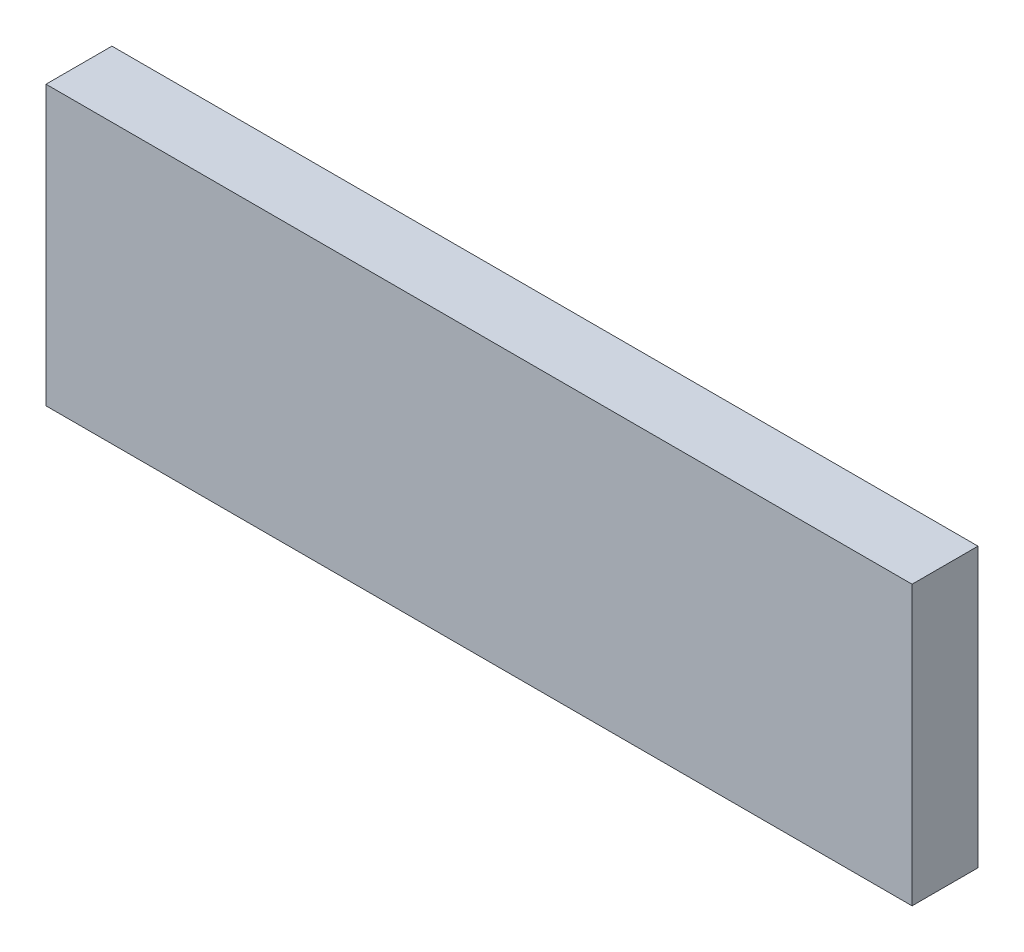
ISO-10303-21;
HEADER;
FILE_DESCRIPTION(('STEP AP214'),'2;1');
FILE_NAME('part.step','',(''),(''),'','','');
FILE_SCHEMA(('AUTOMOTIVE_DESIGN { 1 0 10303 214 1 1 1 1 }'));
ENDSEC;
DATA;
#1=APPLICATION_CONTEXT('core data for automotive mechanical design processes');
#2=APPLICATION_PROTOCOL_DEFINITION('international standard','automotive_design',2000,#1);
#3=PRODUCT_CONTEXT('',#1,'mechanical');
#4=PRODUCT('Part','Part','',(#3));
#5=PRODUCT_RELATED_PRODUCT_CATEGORY('part','',(#4));
#6=PRODUCT_DEFINITION_FORMATION('','',#4);
#7=PRODUCT_DEFINITION_CONTEXT('part definition',#1,'design');
#8=PRODUCT_DEFINITION('design','',#6,#7);
#9=PRODUCT_DEFINITION_SHAPE('','',#8);
#10=(LENGTH_UNIT() NAMED_UNIT(*) SI_UNIT(.MILLI.,.METRE.));
#11=(NAMED_UNIT(*) PLANE_ANGLE_UNIT() SI_UNIT($,.RADIAN.));
#12=(NAMED_UNIT(*) SI_UNIT($,.STERADIAN.) SOLID_ANGLE_UNIT());
#13=UNCERTAINTY_MEASURE_WITH_UNIT(LENGTH_MEASURE(1.E-05),#10,'distance_accuracy_value','');
#14=(GEOMETRIC_REPRESENTATION_CONTEXT(3) GLOBAL_UNCERTAINTY_ASSIGNED_CONTEXT((#13)) GLOBAL_UNIT_ASSIGNED_CONTEXT((#10,
#11,#12)) REPRESENTATION_CONTEXT('',''));
#15=CARTESIAN_POINT('',(0.,0.,0.));
#16=DIRECTION('',(0.,0.,1.));
#17=DIRECTION('',(1.,0.,0.));
#18=AXIS2_PLACEMENT_3D('',#15,#16,#17);
#19=CARTESIAN_POINT('',(13.135,4.225,2.));
#20=DIRECTION('',(-1.,0.,0.));
#21=DIRECTION('',(0.,-1.,0.));
#22=AXIS2_PLACEMENT_3D('',#19,#20,#21);
#23=PLANE('',#22);
#24=DIRECTION('',(0.,1.,0.));
#25=VECTOR('',#24,1.);
#26=CARTESIAN_POINT('',(13.135,4.225,0.));
#27=LINE('',#26,#25);
#28=CARTESIAN_POINT('',(13.135,-4.225,0.));
#29=VERTEX_POINT('',#28);
#30=CARTESIAN_POINT('',(13.135,4.225,0.));
#31=VERTEX_POINT('',#30);
#32=EDGE_CURVE('E99',#29,#31,#27,.T.);
#33=ORIENTED_EDGE('',*,*,#32,.T.);
#34=DIRECTION('',(0.,0.,-1.));
#35=VECTOR('',#34,1.);
#36=CARTESIAN_POINT('',(13.135,4.225,2.));
#37=LINE('',#36,#35);
#38=CARTESIAN_POINT('',(13.135,4.225,2.));
#39=VERTEX_POINT('',#38);
#40=EDGE_CURVE('E11',#39,#31,#37,.T.);
#41=ORIENTED_EDGE('',*,*,#40,.F.);
#42=DIRECTION('',(0.,1.,0.));
#43=VECTOR('',#42,1.);
#44=CARTESIAN_POINT('',(13.135,4.225,2.));
#45=LINE('',#44,#43);
#46=CARTESIAN_POINT('',(13.135,-4.225,2.));
#47=VERTEX_POINT('',#46);
#48=EDGE_CURVE('E87',#47,#39,#45,.T.);
#49=ORIENTED_EDGE('',*,*,#48,.F.);
#50=DIRECTION('',(0.,0.,-1.));
#51=VECTOR('',#50,1.);
#52=CARTESIAN_POINT('',(13.135,-4.225,2.));
#53=LINE('',#52,#51);
#54=EDGE_CURVE('E95',#47,#29,#53,.T.);
#55=ORIENTED_EDGE('',*,*,#54,.T.);
#56=EDGE_LOOP('',(#33,#41,#49,#55));
#57=FACE_BOUND('',#56,.T.);
#58=ADVANCED_FACE('F36',(#57),#23,.F.);
#59=CARTESIAN_POINT('',(-13.135,4.225,2.));
#60=DIRECTION('',(0.,-1.,0.));
#61=DIRECTION('',(0.,0.,-1.));
#62=AXIS2_PLACEMENT_3D('',#59,#60,#61);
#63=PLANE('',#62);
#64=DIRECTION('',(-1.,0.,0.));
#65=VECTOR('',#64,1.);
#66=CARTESIAN_POINT('',(-13.135,4.225,0.));
#67=LINE('',#66,#65);
#68=CARTESIAN_POINT('',(-13.135,4.225,0.));
#69=VERTEX_POINT('',#68);
#70=EDGE_CURVE('E91',#31,#69,#67,.T.);
#71=ORIENTED_EDGE('',*,*,#70,.T.);
#72=DIRECTION('',(0.,0.,-1.));
#73=VECTOR('',#72,1.);
#74=CARTESIAN_POINT('',(-13.135,4.225,2.));
#75=LINE('',#74,#73);
#76=CARTESIAN_POINT('',(-13.135,4.225,2.));
#77=VERTEX_POINT('',#76);
#78=EDGE_CURVE('E44',#77,#69,#75,.T.);
#79=ORIENTED_EDGE('',*,*,#78,.F.);
#80=DIRECTION('',(-1.,0.,0.));
#81=VECTOR('',#80,1.);
#82=CARTESIAN_POINT('',(-13.135,4.225,2.));
#83=LINE('',#82,#81);
#84=EDGE_CURVE('E82',#39,#77,#83,.T.);
#85=ORIENTED_EDGE('',*,*,#84,.F.);
#86=ORIENTED_EDGE('',*,*,#40,.T.);
#87=EDGE_LOOP('',(#71,#79,#85,#86));
#88=FACE_BOUND('',#87,.T.);
#89=ADVANCED_FACE('F90',(#88),#63,.F.);
#90=CARTESIAN_POINT('',(-13.135,4.225,2.));
#91=DIRECTION('',(1.,0.,0.));
#92=DIRECTION('',(0.,1.,0.));
#93=AXIS2_PLACEMENT_3D('',#90,#91,#92);
#94=PLANE('',#93);
#95=DIRECTION('',(0.,-1.,0.));
#96=VECTOR('',#95,1.);
#97=CARTESIAN_POINT('',(-13.135,4.225,0.));
#98=LINE('',#97,#96);
#99=CARTESIAN_POINT('',(-13.135,-4.225,0.));
#100=VERTEX_POINT('',#99);
#101=EDGE_CURVE('E69',#69,#100,#98,.T.);
#102=ORIENTED_EDGE('',*,*,#101,.T.);
#103=DIRECTION('',(0.,0.,-1.));
#104=VECTOR('',#103,1.);
#105=CARTESIAN_POINT('',(-13.135,-4.225,2.));
#106=LINE('',#105,#104);
#107=CARTESIAN_POINT('',(-13.135,-4.225,2.));
#108=VERTEX_POINT('',#107);
#109=EDGE_CURVE('E92',#108,#100,#106,.T.);
#110=ORIENTED_EDGE('',*,*,#109,.F.);
#111=DIRECTION('',(0.,-1.,0.));
#112=VECTOR('',#111,1.);
#113=CARTESIAN_POINT('',(-13.135,4.225,2.));
#114=LINE('',#113,#112);
#115=EDGE_CURVE('E85',#77,#108,#114,.T.);
#116=ORIENTED_EDGE('',*,*,#115,.F.);
#117=ORIENTED_EDGE('',*,*,#78,.T.);
#118=EDGE_LOOP('',(#102,#110,#116,#117));
#119=FACE_BOUND('',#118,.T.);
#120=ADVANCED_FACE('F93',(#119),#94,.F.);
#121=CARTESIAN_POINT('',(-13.135,-4.225,2.));
#122=DIRECTION('',(0.,1.,0.));
#123=DIRECTION('',(0.,0.,1.));
#124=AXIS2_PLACEMENT_3D('',#121,#122,#123);
#125=PLANE('',#124);
#126=DIRECTION('',(1.,0.,0.));
#127=VECTOR('',#126,1.);
#128=CARTESIAN_POINT('',(-13.135,-4.225,0.));
#129=LINE('',#128,#127);
#130=EDGE_CURVE('E75',#100,#29,#129,.T.);
#131=ORIENTED_EDGE('',*,*,#130,.T.);
#132=ORIENTED_EDGE('',*,*,#54,.F.);
#133=DIRECTION('',(1.,0.,0.));
#134=VECTOR('',#133,1.);
#135=CARTESIAN_POINT('',(-13.135,-4.225,2.));
#136=LINE('',#135,#134);
#137=EDGE_CURVE('E52',#108,#47,#136,.T.);
#138=ORIENTED_EDGE('',*,*,#137,.F.);
#139=ORIENTED_EDGE('',*,*,#109,.T.);
#140=EDGE_LOOP('',(#131,#132,#138,#139));
#141=FACE_BOUND('',#140,.T.);
#142=ADVANCED_FACE('F106',(#141),#125,.F.);
#143=CARTESIAN_POINT('',(0.,0.,2.));
#144=DIRECTION('',(0.,0.,1.));
#145=DIRECTION('',(1.,0.,0.));
#146=AXIS2_PLACEMENT_3D('',#143,#144,#145);
#147=PLANE('',#146);
#148=ORIENTED_EDGE('',*,*,#48,.T.);
#149=ORIENTED_EDGE('',*,*,#84,.T.);
#150=ORIENTED_EDGE('',*,*,#115,.T.);
#151=ORIENTED_EDGE('',*,*,#137,.T.);
#152=EDGE_LOOP('',(#148,#149,#150,#151));
#153=FACE_BOUND('',#152,.T.);
#154=ADVANCED_FACE('F83',(#153),#147,.T.);
#155=CARTESIAN_POINT('',(0.,0.,0.));
#156=DIRECTION('',(0.,0.,1.));
#157=DIRECTION('',(1.,0.,0.));
#158=AXIS2_PLACEMENT_3D('',#155,#156,#157);
#159=PLANE('',#158);
#160=ORIENTED_EDGE('',*,*,#32,.F.);
#161=ORIENTED_EDGE('',*,*,#130,.F.);
#162=ORIENTED_EDGE('',*,*,#101,.F.);
#163=ORIENTED_EDGE('',*,*,#70,.F.);
#164=EDGE_LOOP('',(#160,#161,#162,#163));
#165=FACE_BOUND('',#164,.T.);
#166=ADVANCED_FACE('F109',(#165),#159,.F.);
#167=CLOSED_SHELL('',(#58,#89,#120,#142,#154,#166));
#168=MANIFOLD_SOLID_BREP('B2',#167);
#169=ADVANCED_BREP_SHAPE_REPRESENTATION('',(#18,#168),#14);
#170=SHAPE_DEFINITION_REPRESENTATION(#9,#169);
ENDSEC;
END-ISO-10303-21;
